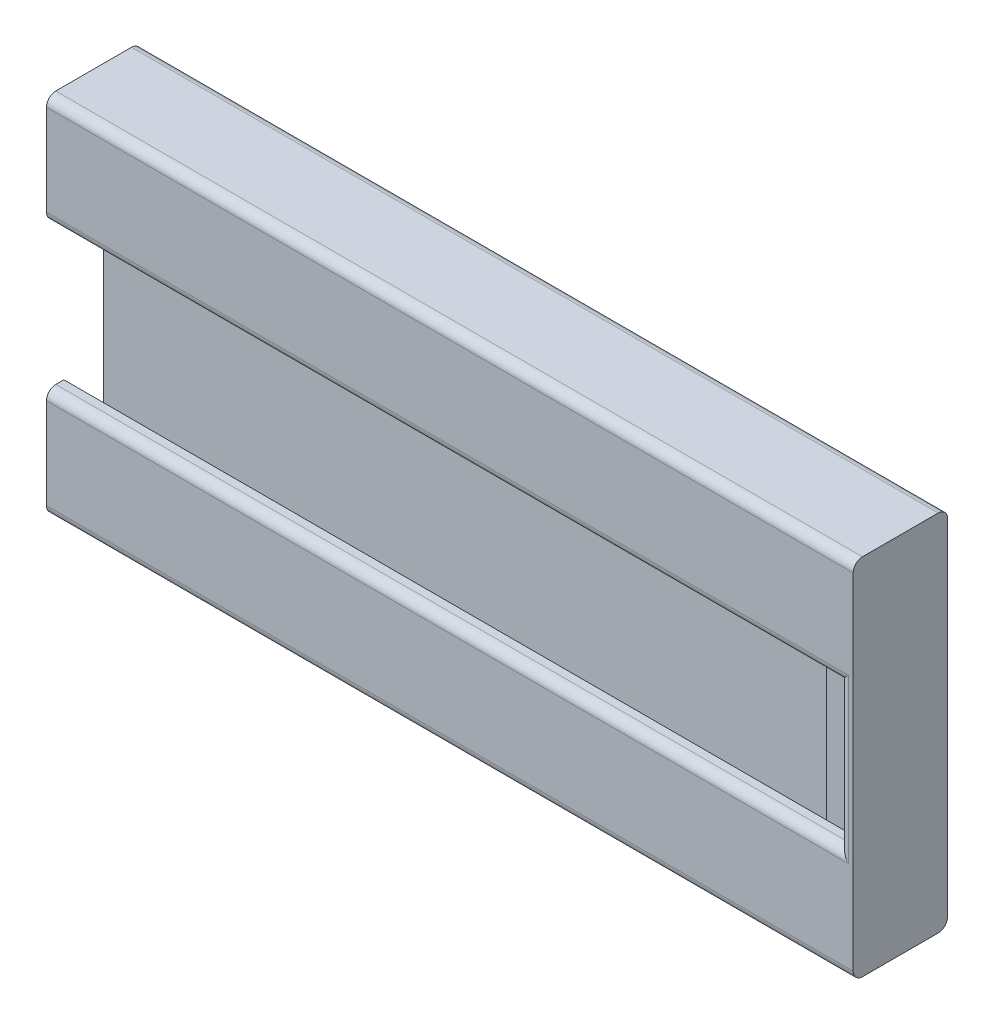
ISO-10303-21;
HEADER;
FILE_DESCRIPTION(('STEP AP214'),'2;1');
FILE_NAME('part.step','',(''),(''),'','','');
FILE_SCHEMA(('AUTOMOTIVE_DESIGN { 1 0 10303 214 1 1 1 1 }'));
ENDSEC;
DATA;
#1=APPLICATION_CONTEXT('core data for automotive mechanical design processes');
#2=APPLICATION_PROTOCOL_DEFINITION('international standard','automotive_design',2000,#1);
#3=PRODUCT_CONTEXT('',#1,'mechanical');
#4=PRODUCT('Part','Part','',(#3));
#5=PRODUCT_RELATED_PRODUCT_CATEGORY('part','',(#4));
#6=PRODUCT_DEFINITION_FORMATION('','',#4);
#7=PRODUCT_DEFINITION_CONTEXT('part definition',#1,'design');
#8=PRODUCT_DEFINITION('design','',#6,#7);
#9=PRODUCT_DEFINITION_SHAPE('','',#8);
#10=(LENGTH_UNIT() NAMED_UNIT(*) SI_UNIT(.MILLI.,.METRE.));
#11=(NAMED_UNIT(*) PLANE_ANGLE_UNIT() SI_UNIT($,.RADIAN.));
#12=(NAMED_UNIT(*) SI_UNIT($,.STERADIAN.) SOLID_ANGLE_UNIT());
#13=UNCERTAINTY_MEASURE_WITH_UNIT(LENGTH_MEASURE(1.E-05),#10,'distance_accuracy_value','');
#14=(GEOMETRIC_REPRESENTATION_CONTEXT(3) GLOBAL_UNCERTAINTY_ASSIGNED_CONTEXT((#13)) GLOBAL_UNIT_ASSIGNED_CONTEXT((#10,
#11,#12)) REPRESENTATION_CONTEXT('',''));
#15=CARTESIAN_POINT('',(0.,0.,0.));
#16=DIRECTION('',(0.,0.,1.));
#17=DIRECTION('',(1.,0.,0.));
#18=AXIS2_PLACEMENT_3D('',#15,#16,#17);
#19=CARTESIAN_POINT('',(-40.2911083721896,0.,6.25));
#20=DIRECTION('',(0.,0.,1.));
#21=DIRECTION('',(1.,0.,0.));
#22=AXIS2_PLACEMENT_3D('',#19,#20,#21);
#23=PLANE('',#22);
#24=DIRECTION('',(1.,0.,0.));
#25=VECTOR('',#24,1.);
#26=CARTESIAN_POINT('',(-40.2911083721896,-0.249999999999984,6.25));
#27=LINE('',#26,#25);
#28=CARTESIAN_POINT('',(0.,-0.25,6.25));
#29=VERTEX_POINT('',#28);
#30=CARTESIAN_POINT('',(85.,-0.250000000000034,6.25));
#31=VERTEX_POINT('',#30);
#32=EDGE_CURVE('E206',#29,#31,#27,.T.);
#33=ORIENTED_EDGE('',*,*,#32,.F.);
#34=DIRECTION('',(0.,1.,0.));
#35=VECTOR('',#34,1.);
#36=CARTESIAN_POINT('',(0.,0.,6.25));
#37=LINE('',#36,#35);
#38=CARTESIAN_POINT('',(0.,9.75,6.25));
#39=VERTEX_POINT('',#38);
#40=EDGE_CURVE('E267',#29,#39,#37,.T.);
#41=ORIENTED_EDGE('',*,*,#40,.T.);
#42=DIRECTION('',(1.,0.,0.));
#43=VECTOR('',#42,1.);
#44=CARTESIAN_POINT('',(-40.2911083721896,9.75000000000002,6.25));
#45=LINE('',#44,#43);
#46=CARTESIAN_POINT('',(85.,9.74999999999997,6.25));
#47=VERTEX_POINT('',#46);
#48=EDGE_CURVE('E205',#39,#47,#45,.T.);
#49=ORIENTED_EDGE('',*,*,#48,.T.);
#50=DIRECTION('',(0.,-1.,0.));
#51=VECTOR('',#50,1.);
#52=CARTESIAN_POINT('',(85.,0.,6.25));
#53=LINE('',#52,#51);
#54=EDGE_CURVE('E194',#47,#31,#53,.T.);
#55=ORIENTED_EDGE('',*,*,#54,.T.);
#56=EDGE_LOOP('',(#33,#41,#49,#55));
#57=FACE_BOUND('',#56,.T.);
#58=ADVANCED_FACE('F63',(#57),#23,.F.);
#59=CARTESIAN_POINT('',(-40.2911083721896,-0.249999999999984,0.));
#60=DIRECTION('',(0.,-1.,0.));
#61=DIRECTION('',(1.,0.,0.));
#62=AXIS2_PLACEMENT_3D('',#59,#60,#61);
#63=PLANE('',#62);
#64=DIRECTION('',(1.,0.,0.));
#65=VECTOR('',#64,1.);
#66=CARTESIAN_POINT('',(-40.2911083721896,-0.249999999999984,-0.250000000000004));
#67=LINE('',#66,#65);
#68=CARTESIAN_POINT('',(0.,-0.250000000000034,-0.250000000000004));
#69=VERTEX_POINT('',#68);
#70=CARTESIAN_POINT('',(85.,-0.250000000000034,-0.250000000000004));
#71=VERTEX_POINT('',#70);
#72=EDGE_CURVE('E213',#69,#71,#67,.T.);
#73=ORIENTED_EDGE('',*,*,#72,.F.);
#74=DIRECTION('',(0.,0.,1.));
#75=VECTOR('',#74,1.);
#76=CARTESIAN_POINT('',(0.,-0.25,0.));
#77=LINE('',#76,#75);
#78=EDGE_CURVE('E208',#69,#29,#77,.T.);
#79=ORIENTED_EDGE('',*,*,#78,.T.);
#80=ORIENTED_EDGE('',*,*,#32,.T.);
#81=DIRECTION('',(0.,0.,-1.));
#82=VECTOR('',#81,1.);
#83=CARTESIAN_POINT('',(85.,-0.250000000000034,0.));
#84=LINE('',#83,#82);
#85=EDGE_CURVE('E190',#31,#71,#84,.T.);
#86=ORIENTED_EDGE('',*,*,#85,.T.);
#87=EDGE_LOOP('',(#73,#79,#80,#86));
#88=FACE_BOUND('',#87,.T.);
#89=ADVANCED_FACE('F210',(#88),#63,.F.);
#90=CARTESIAN_POINT('',(-40.2911083721896,0.,-0.250000000000004));
#91=DIRECTION('',(0.,0.,1.));
#92=DIRECTION('',(1.,0.,0.));
#93=AXIS2_PLACEMENT_3D('',#90,#91,#92);
#94=PLANE('',#93);
#95=DIRECTION('',(0.,1.,0.));
#96=VECTOR('',#95,1.);
#97=CARTESIAN_POINT('',(0.,0.,-0.250000000000004));
#98=LINE('',#97,#96);
#99=CARTESIAN_POINT('',(0.,35.25,-0.250000000000004));
#100=VERTEX_POINT('',#99);
#101=EDGE_CURVE('E387',#69,#100,#98,.T.);
#102=ORIENTED_EDGE('',*,*,#101,.F.);
#103=ORIENTED_EDGE('',*,*,#72,.T.);
#104=DIRECTION('',(0.,-1.,0.));
#105=VECTOR('',#104,1.);
#106=CARTESIAN_POINT('',(85.,0.,-0.250000000000004));
#107=LINE('',#106,#105);
#108=CARTESIAN_POINT('',(85.,35.25,-0.250000000000004));
#109=VERTEX_POINT('',#108);
#110=EDGE_CURVE('E197',#109,#71,#107,.T.);
#111=ORIENTED_EDGE('',*,*,#110,.F.);
#112=DIRECTION('',(1.,0.,0.));
#113=VECTOR('',#112,1.);
#114=CARTESIAN_POINT('',(-40.2911083721896,35.25,-0.250000000000004));
#115=LINE('',#114,#113);
#116=EDGE_CURVE('E251',#100,#109,#115,.T.);
#117=ORIENTED_EDGE('',*,*,#116,.F.);
#118=EDGE_LOOP('',(#102,#103,#111,#117));
#119=FACE_BOUND('',#118,.T.);
#120=ADVANCED_FACE('F419',(#119),#94,.T.);
#121=CARTESIAN_POINT('',(-40.2911083721896,35.25,-1.88150777009792E-13));
#122=DIRECTION('',(0.,-1.,0.));
#123=DIRECTION('',(0.,0.,-1.));
#124=AXIS2_PLACEMENT_3D('',#121,#122,#123);
#125=PLANE('',#124);
#126=DIRECTION('',(0.,0.,1.));
#127=VECTOR('',#126,1.);
#128=CARTESIAN_POINT('',(0.,35.25,-1.88150777009792E-13));
#129=LINE('',#128,#127);
#130=CARTESIAN_POINT('',(0.,35.2500000000001,6.25));
#131=VERTEX_POINT('',#130);
#132=EDGE_CURVE('E383',#100,#131,#129,.T.);
#133=ORIENTED_EDGE('',*,*,#132,.F.);
#134=ORIENTED_EDGE('',*,*,#116,.T.);
#135=DIRECTION('',(0.,0.,-1.));
#136=VECTOR('',#135,1.);
#137=CARTESIAN_POINT('',(85.,35.25,-1.88150777009792E-13));
#138=LINE('',#137,#136);
#139=CARTESIAN_POINT('',(85.,35.25,6.25));
#140=VERTEX_POINT('',#139);
#141=EDGE_CURVE('E231',#140,#109,#138,.T.);
#142=ORIENTED_EDGE('',*,*,#141,.F.);
#143=DIRECTION('',(1.,0.,0.));
#144=VECTOR('',#143,1.);
#145=CARTESIAN_POINT('',(-40.2911083721896,35.2500000000001,6.25));
#146=LINE('',#145,#144);
#147=EDGE_CURVE('E260',#131,#140,#146,.T.);
#148=ORIENTED_EDGE('',*,*,#147,.F.);
#149=EDGE_LOOP('',(#133,#134,#142,#148));
#150=FACE_BOUND('',#149,.T.);
#151=ADVANCED_FACE('F414',(#150),#125,.T.);
#152=DIRECTION('',(1.,0.,0.));
#153=VECTOR('',#152,1.);
#154=CARTESIAN_POINT('',(-40.2911083721896,25.2500000000001,6.24999999999999));
#155=LINE('',#154,#153);
#156=CARTESIAN_POINT('',(0.,25.2500000000001,6.24999999999999));
#157=VERTEX_POINT('',#156);
#158=CARTESIAN_POINT('',(85.,25.25,6.24999999999999));
#159=VERTEX_POINT('',#158);
#160=EDGE_CURVE('E257',#157,#159,#155,.T.);
#161=ORIENTED_EDGE('',*,*,#160,.F.);
#162=DIRECTION('',(0.,1.,0.));
#163=VECTOR('',#162,1.);
#164=CARTESIAN_POINT('',(0.,0.,6.25));
#165=LINE('',#164,#163);
#166=EDGE_CURVE('E379',#157,#131,#165,.T.);
#167=ORIENTED_EDGE('',*,*,#166,.T.);
#168=ORIENTED_EDGE('',*,*,#147,.T.);
#169=EDGE_CURVE('E222',#140,#159,#53,.T.);
#170=ORIENTED_EDGE('',*,*,#169,.T.);
#171=EDGE_LOOP('',(#161,#167,#168,#170));
#172=FACE_BOUND('',#171,.T.);
#173=ADVANCED_FACE('F415',(#172),#23,.F.);
#174=CARTESIAN_POINT('',(-40.2911083721896,25.2500000000001,0.));
#175=DIRECTION('',(0.,1.,0.));
#176=DIRECTION('',(0.,0.,1.));
#177=AXIS2_PLACEMENT_3D('',#174,#175,#176);
#178=PLANE('',#177);
#179=DIRECTION('',(0.,0.,1.));
#180=VECTOR('',#179,1.);
#181=CARTESIAN_POINT('',(85.,25.25,0.));
#182=LINE('',#181,#180);
#183=CARTESIAN_POINT('',(85.,25.25,7.11797479041743));
#184=VERTEX_POINT('',#183);
#185=EDGE_CURVE('E223',#159,#184,#182,.T.);
#186=ORIENTED_EDGE('',*,*,#185,.T.);
#187=DIRECTION('',(1.,0.,0.));
#188=VECTOR('',#187,1.);
#189=CARTESIAN_POINT('',(0.,25.2500000000001,7.11797479041743));
#190=LINE('',#189,#188);
#191=CARTESIAN_POINT('',(0.,25.2500000000001,7.11797479041743));
#192=VERTEX_POINT('',#191);
#193=EDGE_CURVE('E289',#184,#192,#190,.F.);
#194=ORIENTED_EDGE('',*,*,#193,.T.);
#195=DIRECTION('',(0.,0.,-1.));
#196=VECTOR('',#195,1.);
#197=CARTESIAN_POINT('',(0.,25.2500000000001,0.));
#198=LINE('',#197,#196);
#199=EDGE_CURVE('E378',#192,#157,#198,.T.);
#200=ORIENTED_EDGE('',*,*,#199,.T.);
#201=ORIENTED_EDGE('',*,*,#160,.T.);
#202=EDGE_LOOP('',(#186,#194,#200,#201));
#203=FACE_BOUND('',#202,.T.);
#204=ADVANCED_FACE('F409',(#203),#178,.F.);
#205=CARTESIAN_POINT('',(-40.2911083721896,0.,8.11797479041744));
#206=DIRECTION('',(0.,0.,1.));
#207=DIRECTION('',(1.,0.,0.));
#208=AXIS2_PLACEMENT_3D('',#205,#206,#207);
#209=PLANE('',#208);
#210=DIRECTION('',(0.,1.,0.));
#211=VECTOR('',#210,1.);
#212=CARTESIAN_POINT('',(0.,0.,8.11797479041744));
#213=LINE('',#212,#211);
#214=CARTESIAN_POINT('',(0.,26.2500000000001,8.11797479041744));
#215=VERTEX_POINT('',#214);
#216=CARTESIAN_POINT('',(0.,36.,8.11797479041744));
#217=VERTEX_POINT('',#216);
#218=EDGE_CURVE('E372',#215,#217,#213,.T.);
#219=ORIENTED_EDGE('',*,*,#218,.F.);
#220=DIRECTION('',(1.,0.,0.));
#221=VECTOR('',#220,1.);
#222=CARTESIAN_POINT('',(85.,26.25,8.11797479041744));
#223=LINE('',#222,#221);
#224=CARTESIAN_POINT('',(86.,26.25,8.11797479041744));
#225=VERTEX_POINT('',#224);
#226=EDGE_CURVE('E282',#215,#225,#223,.T.);
#227=ORIENTED_EDGE('',*,*,#226,.T.);
#228=DIRECTION('',(0.,-1.,0.));
#229=VECTOR('',#228,1.);
#230=CARTESIAN_POINT('',(86.,9.74999999999997,8.11797479041744));
#231=LINE('',#230,#229);
#232=CARTESIAN_POINT('',(86.,8.74999999999997,8.11797479041744));
#233=VERTEX_POINT('',#232);
#234=EDGE_CURVE('E276',#225,#233,#231,.T.);
#235=ORIENTED_EDGE('',*,*,#234,.T.);
#236=DIRECTION('',(1.,0.,0.));
#237=VECTOR('',#236,1.);
#238=CARTESIAN_POINT('',(-40.2911083721896,8.75000000000002,8.11797479041744));
#239=LINE('',#238,#237);
#240=CARTESIAN_POINT('',(0.,8.75,8.11797479041744));
#241=VERTEX_POINT('',#240);
#242=EDGE_CURVE('E277',#233,#241,#239,.F.);
#243=ORIENTED_EDGE('',*,*,#242,.T.);
#244=DIRECTION('',(0.,1.,0.));
#245=VECTOR('',#244,1.);
#246=CARTESIAN_POINT('',(0.,0.,8.11797479041744));
#247=LINE('',#246,#245);
#248=CARTESIAN_POINT('',(0.,-1.,8.11797479041744));
#249=VERTEX_POINT('',#248);
#250=EDGE_CURVE('E215',#249,#241,#247,.T.);
#251=ORIENTED_EDGE('',*,*,#250,.F.);
#252=DIRECTION('',(1.,0.,0.));
#253=VECTOR('',#252,1.);
#254=CARTESIAN_POINT('',(86.5,-1.00000000000004,8.11797479041744));
#255=LINE('',#254,#253);
#256=CARTESIAN_POINT('',(86.5,-1.00000000000004,8.11797479041744));
#257=VERTEX_POINT('',#256);
#258=EDGE_CURVE('E275',#249,#257,#255,.T.);
#259=ORIENTED_EDGE('',*,*,#258,.T.);
#260=DIRECTION('',(0.,-1.,0.));
#261=VECTOR('',#260,1.);
#262=CARTESIAN_POINT('',(86.5,37.,8.11797479041744));
#263=LINE('',#262,#261);
#264=CARTESIAN_POINT('',(86.5,36.,8.11797479041744));
#265=VERTEX_POINT('',#264);
#266=EDGE_CURVE('E347',#265,#257,#263,.T.);
#267=ORIENTED_EDGE('',*,*,#266,.F.);
#268=DIRECTION('',(1.,0.,0.));
#269=VECTOR('',#268,1.);
#270=CARTESIAN_POINT('',(-40.2911083721896,36.,8.11797479041744));
#271=LINE('',#270,#269);
#272=EDGE_CURVE('E268',#265,#217,#271,.F.);
#273=ORIENTED_EDGE('',*,*,#272,.T.);
#274=EDGE_LOOP('',(#219,#227,#235,#243,#251,#259,#267,#273));
#275=FACE_BOUND('',#274,.T.);
#276=ADVANCED_FACE('F402',(#275),#209,.T.);
#277=CARTESIAN_POINT('',(-40.2911083721896,37.0000000000001,0.));
#278=DIRECTION('',(0.,1.,0.));
#279=DIRECTION('',(-1.,0.,0.));
#280=AXIS2_PLACEMENT_3D('',#277,#278,#279);
#281=PLANE('',#280);
#282=DIRECTION('',(0.,0.,-1.));
#283=VECTOR('',#282,1.);
#284=CARTESIAN_POINT('',(0.,37.,0.));
#285=LINE('',#284,#283);
#286=CARTESIAN_POINT('',(0.,37.,7.11797479041744));
#287=VERTEX_POINT('',#286);
#288=CARTESIAN_POINT('',(0.,37.,-1.));
#289=VERTEX_POINT('',#288);
#290=EDGE_CURVE('E367',#287,#289,#285,.T.);
#291=ORIENTED_EDGE('',*,*,#290,.F.);
#292=DIRECTION('',(1.,0.,0.));
#293=VECTOR('',#292,1.);
#294=CARTESIAN_POINT('',(-40.2911083721896,37.0000000000001,7.11797479041744));
#295=LINE('',#294,#293);
#296=CARTESIAN_POINT('',(86.5,37.,7.11797479041744));
#297=VERTEX_POINT('',#296);
#298=EDGE_CURVE('E12',#287,#297,#295,.T.);
#299=ORIENTED_EDGE('',*,*,#298,.T.);
#300=DIRECTION('',(0.,0.,1.));
#301=VECTOR('',#300,1.);
#302=CARTESIAN_POINT('',(86.5,37.,8.11797479041744));
#303=LINE('',#302,#301);
#304=CARTESIAN_POINT('',(86.5,37.,-0.999999999999999));
#305=VERTEX_POINT('',#304);
#306=EDGE_CURVE('E218',#305,#297,#303,.T.);
#307=ORIENTED_EDGE('',*,*,#306,.F.);
#308=DIRECTION('',(1.,0.,0.));
#309=VECTOR('',#308,1.);
#310=CARTESIAN_POINT('',(0.,37.,-1.));
#311=LINE('',#310,#309);
#312=EDGE_CURVE('E72',#305,#289,#311,.F.);
#313=ORIENTED_EDGE('',*,*,#312,.T.);
#314=EDGE_LOOP('',(#291,#299,#307,#313));
#315=FACE_BOUND('',#314,.T.);
#316=ADVANCED_FACE('F464',(#315),#281,.T.);
#317=CARTESIAN_POINT('',(-40.2911083721896,0.,-2.));
#318=DIRECTION('',(0.,0.,1.));
#319=DIRECTION('',(0.,-1.,0.));
#320=AXIS2_PLACEMENT_3D('',#317,#318,#319);
#321=PLANE('',#320);
#322=DIRECTION('',(0.,1.,0.));
#323=VECTOR('',#322,1.);
#324=CARTESIAN_POINT('',(86.5,37.,-2.));
#325=LINE('',#324,#323);
#326=CARTESIAN_POINT('',(86.5,-1.00000000000004,-2.));
#327=VERTEX_POINT('',#326);
#328=CARTESIAN_POINT('',(86.5,36.,-2.));
#329=VERTEX_POINT('',#328);
#330=EDGE_CURVE('E227',#327,#329,#325,.T.);
#331=ORIENTED_EDGE('',*,*,#330,.F.);
#332=DIRECTION('',(1.,0.,0.));
#333=VECTOR('',#332,1.);
#334=CARTESIAN_POINT('',(-40.2911083721896,-0.999999999999986,-2.));
#335=LINE('',#334,#333);
#336=CARTESIAN_POINT('',(0.,-1.,-2.));
#337=VERTEX_POINT('',#336);
#338=EDGE_CURVE('E332',#327,#337,#335,.F.);
#339=ORIENTED_EDGE('',*,*,#338,.T.);
#340=DIRECTION('',(0.,1.,0.));
#341=VECTOR('',#340,1.);
#342=CARTESIAN_POINT('',(0.,0.,-2.));
#343=LINE('',#342,#341);
#344=CARTESIAN_POINT('',(0.,36.,-2.));
#345=VERTEX_POINT('',#344);
#346=EDGE_CURVE('E368',#337,#345,#343,.T.);
#347=ORIENTED_EDGE('',*,*,#346,.T.);
#348=DIRECTION('',(1.,0.,0.));
#349=VECTOR('',#348,1.);
#350=CARTESIAN_POINT('',(86.5,36.,-2.));
#351=LINE('',#350,#349);
#352=EDGE_CURVE('E330',#345,#329,#351,.T.);
#353=ORIENTED_EDGE('',*,*,#352,.T.);
#354=EDGE_LOOP('',(#331,#339,#347,#353));
#355=FACE_BOUND('',#354,.T.);
#356=ADVANCED_FACE('F469',(#355),#321,.F.);
#357=CARTESIAN_POINT('',(-40.2911083721896,-1.99999999999999,0.));
#358=DIRECTION('',(0.,1.,0.));
#359=DIRECTION('',(-1.,0.,0.));
#360=AXIS2_PLACEMENT_3D('',#357,#358,#359);
#361=PLANE('',#360);
#362=DIRECTION('',(0.,0.,-1.));
#363=VECTOR('',#362,1.);
#364=CARTESIAN_POINT('',(86.5,-2.00000000000004,8.11797479041744));
#365=LINE('',#364,#363);
#366=CARTESIAN_POINT('',(86.5,-2.00000000000004,7.11797479041744));
#367=VERTEX_POINT('',#366);
#368=CARTESIAN_POINT('',(86.5,-2.00000000000004,-0.999999999999997));
#369=VERTEX_POINT('',#368);
#370=EDGE_CURVE('E348',#367,#369,#365,.T.);
#371=ORIENTED_EDGE('',*,*,#370,.F.);
#372=DIRECTION('',(1.,0.,0.));
#373=VECTOR('',#372,1.);
#374=CARTESIAN_POINT('',(0.,-2.,7.11797479041744));
#375=LINE('',#374,#373);
#376=CARTESIAN_POINT('',(0.,-2.,7.11797479041744));
#377=VERTEX_POINT('',#376);
#378=EDGE_CURVE('E322',#367,#377,#375,.F.);
#379=ORIENTED_EDGE('',*,*,#378,.T.);
#380=DIRECTION('',(0.,0.,-1.));
#381=VECTOR('',#380,1.);
#382=CARTESIAN_POINT('',(0.,-2.,0.));
#383=LINE('',#382,#381);
#384=CARTESIAN_POINT('',(0.,-2.,-0.999999999999997));
#385=VERTEX_POINT('',#384);
#386=EDGE_CURVE('E361',#377,#385,#383,.T.);
#387=ORIENTED_EDGE('',*,*,#386,.T.);
#388=DIRECTION('',(1.,0.,0.));
#389=VECTOR('',#388,1.);
#390=CARTESIAN_POINT('',(-40.2911083721896,-1.99999999999999,-0.999999999999997));
#391=LINE('',#390,#389);
#392=EDGE_CURVE('E319',#385,#369,#391,.T.);
#393=ORIENTED_EDGE('',*,*,#392,.T.);
#394=EDGE_LOOP('',(#371,#379,#387,#393));
#395=FACE_BOUND('',#394,.T.);
#396=ADVANCED_FACE('F478',(#395),#361,.F.);
#397=CARTESIAN_POINT('',(-40.2911083721896,9.75000000000002,0.));
#398=DIRECTION('',(0.,1.,0.));
#399=DIRECTION('',(-1.,0.,0.));
#400=AXIS2_PLACEMENT_3D('',#397,#398,#399);
#401=PLANE('',#400);
#402=DIRECTION('',(0.,0.,-1.));
#403=VECTOR('',#402,1.);
#404=CARTESIAN_POINT('',(0.,9.75,0.));
#405=LINE('',#404,#403);
#406=CARTESIAN_POINT('',(0.,9.75,7.11797479041744));
#407=VERTEX_POINT('',#406);
#408=EDGE_CURVE('E264',#407,#39,#405,.T.);
#409=ORIENTED_EDGE('',*,*,#408,.F.);
#410=DIRECTION('',(1.,0.,0.));
#411=VECTOR('',#410,1.);
#412=CARTESIAN_POINT('',(-40.2911083721896,9.75000000000002,7.11797479041744));
#413=LINE('',#412,#411);
#414=CARTESIAN_POINT('',(85.,9.74999999999997,7.11797479041744));
#415=VERTEX_POINT('',#414);
#416=EDGE_CURVE('E306',#407,#415,#413,.T.);
#417=ORIENTED_EDGE('',*,*,#416,.T.);
#418=DIRECTION('',(0.,0.,1.));
#419=VECTOR('',#418,1.);
#420=CARTESIAN_POINT('',(85.,9.74999999999997,0.));
#421=LINE('',#420,#419);
#422=EDGE_CURVE('E217',#47,#415,#421,.T.);
#423=ORIENTED_EDGE('',*,*,#422,.F.);
#424=ORIENTED_EDGE('',*,*,#48,.F.);
#425=EDGE_LOOP('',(#409,#417,#423,#424));
#426=FACE_BOUND('',#425,.T.);
#427=ADVANCED_FACE('F394',(#426),#401,.T.);
#428=CARTESIAN_POINT('',(0.,0.,2.));
#429=DIRECTION('',(1.,0.,0.));
#430=DIRECTION('',(0.,1.,0.));
#431=AXIS2_PLACEMENT_3D('',#428,#429,#430);
#432=PLANE('',#431);
#433=ORIENTED_EDGE('',*,*,#199,.F.);
#434=CARTESIAN_POINT('',(0.,26.2500000000001,7.11797479041744));
#435=DIRECTION('',(1.,0.,0.));
#436=DIRECTION('',(0.,1.,0.));
#437=AXIS2_PLACEMENT_3D('',#434,#435,#436);
#438=CIRCLE('',#437,1.);
#439=EDGE_CURVE('E302',#192,#215,#438,.F.);
#440=ORIENTED_EDGE('',*,*,#439,.T.);
#441=ORIENTED_EDGE('',*,*,#218,.T.);
#442=CARTESIAN_POINT('',(0.,36.,7.11797479041744));
#443=DIRECTION('',(1.,0.,0.));
#444=DIRECTION('',(0.,1.,0.));
#445=AXIS2_PLACEMENT_3D('',#442,#443,#444);
#446=CIRCLE('',#445,1.);
#447=EDGE_CURVE('E291',#217,#287,#446,.F.);
#448=ORIENTED_EDGE('',*,*,#447,.T.);
#449=ORIENTED_EDGE('',*,*,#290,.T.);
#450=CARTESIAN_POINT('',(0.,36.,-1.));
#451=DIRECTION('',(1.,0.,0.));
#452=DIRECTION('',(0.,1.,0.));
#453=AXIS2_PLACEMENT_3D('',#450,#451,#452);
#454=CIRCLE('',#453,1.);
#455=EDGE_CURVE('E292',#289,#345,#454,.F.);
#456=ORIENTED_EDGE('',*,*,#455,.T.);
#457=ORIENTED_EDGE('',*,*,#346,.F.);
#458=CARTESIAN_POINT('',(0.,-1.,-0.999999999999997));
#459=DIRECTION('',(1.,0.,0.));
#460=DIRECTION('',(0.,1.,0.));
#461=AXIS2_PLACEMENT_3D('',#458,#459,#460);
#462=CIRCLE('',#461,1.);
#463=EDGE_CURVE('E298',#337,#385,#462,.F.);
#464=ORIENTED_EDGE('',*,*,#463,.T.);
#465=ORIENTED_EDGE('',*,*,#386,.F.);
#466=CARTESIAN_POINT('',(0.,-1.,7.11797479041744));
#467=DIRECTION('',(1.,0.,0.));
#468=DIRECTION('',(0.,1.,0.));
#469=AXIS2_PLACEMENT_3D('',#466,#467,#468);
#470=CIRCLE('',#469,1.);
#471=EDGE_CURVE('E300',#377,#249,#470,.F.);
#472=ORIENTED_EDGE('',*,*,#471,.T.);
#473=ORIENTED_EDGE('',*,*,#250,.T.);
#474=CARTESIAN_POINT('',(0.,8.75,7.11797479041744));
#475=DIRECTION('',(1.,0.,0.));
#476=DIRECTION('',(0.,1.,0.));
#477=AXIS2_PLACEMENT_3D('',#474,#475,#476);
#478=CIRCLE('',#477,1.);
#479=EDGE_CURVE('E305',#241,#407,#478,.F.);
#480=ORIENTED_EDGE('',*,*,#479,.T.);
#481=ORIENTED_EDGE('',*,*,#408,.T.);
#482=ORIENTED_EDGE('',*,*,#40,.F.);
#483=ORIENTED_EDGE('',*,*,#78,.F.);
#484=ORIENTED_EDGE('',*,*,#101,.T.);
#485=ORIENTED_EDGE('',*,*,#132,.T.);
#486=ORIENTED_EDGE('',*,*,#166,.F.);
#487=EDGE_LOOP('',(#433,#440,#441,#448,#449,#456,#457,#464,#465,#472,#473,#480,#481,#482,#483,
#484,#485,#486));
#488=FACE_BOUND('',#487,.T.);
#489=ADVANCED_FACE('F410',(#488),#432,.F.);
#490=CARTESIAN_POINT('',(85.,0.,0.));
#491=DIRECTION('',(1.,0.,0.));
#492=DIRECTION('',(0.,1.,0.));
#493=AXIS2_PLACEMENT_3D('',#490,#491,#492);
#494=PLANE('',#493);
#495=ORIENTED_EDGE('',*,*,#422,.T.);
#496=DIRECTION('',(0.,-1.,0.));
#497=VECTOR('',#496,1.);
#498=CARTESIAN_POINT('',(85.,25.25,7.11797479041744));
#499=LINE('',#498,#497);
#500=EDGE_CURVE('E288',#415,#184,#499,.F.);
#501=ORIENTED_EDGE('',*,*,#500,.T.);
#502=ORIENTED_EDGE('',*,*,#185,.F.);
#503=ORIENTED_EDGE('',*,*,#169,.F.);
#504=ORIENTED_EDGE('',*,*,#141,.T.);
#505=ORIENTED_EDGE('',*,*,#110,.T.);
#506=ORIENTED_EDGE('',*,*,#85,.F.);
#507=ORIENTED_EDGE('',*,*,#54,.F.);
#508=EDGE_LOOP('',(#495,#501,#502,#503,#504,#505,#506,#507));
#509=FACE_BOUND('',#508,.T.);
#510=ADVANCED_FACE('F195',(#509),#494,.F.);
#511=CARTESIAN_POINT('',(86.5,0.,0.));
#512=DIRECTION('',(1.,0.,0.));
#513=DIRECTION('',(0.,1.,0.));
#514=AXIS2_PLACEMENT_3D('',#511,#512,#513);
#515=PLANE('',#514);
#516=ORIENTED_EDGE('',*,*,#266,.T.);
#517=CARTESIAN_POINT('',(86.5,-1.00000000000004,7.11797479041744));
#518=DIRECTION('',(1.,0.,0.));
#519=DIRECTION('',(0.,1.,0.));
#520=AXIS2_PLACEMENT_3D('',#517,#518,#519);
#521=CIRCLE('',#520,1.);
#522=EDGE_CURVE('E320',#257,#367,#521,.T.);
#523=ORIENTED_EDGE('',*,*,#522,.T.);
#524=ORIENTED_EDGE('',*,*,#370,.T.);
#525=CARTESIAN_POINT('',(86.5,-1.00000000000004,-0.999999999999997));
#526=DIRECTION('',(1.,0.,0.));
#527=DIRECTION('',(0.,1.,0.));
#528=AXIS2_PLACEMENT_3D('',#525,#526,#527);
#529=CIRCLE('',#528,1.);
#530=EDGE_CURVE('E314',#369,#327,#529,.T.);
#531=ORIENTED_EDGE('',*,*,#530,.T.);
#532=ORIENTED_EDGE('',*,*,#330,.T.);
#533=CARTESIAN_POINT('',(86.5,36.,-1.));
#534=DIRECTION('',(1.,0.,0.));
#535=DIRECTION('',(0.,1.,0.));
#536=AXIS2_PLACEMENT_3D('',#533,#534,#535);
#537=CIRCLE('',#536,1.);
#538=EDGE_CURVE('E88',#329,#305,#537,.T.);
#539=ORIENTED_EDGE('',*,*,#538,.T.);
#540=ORIENTED_EDGE('',*,*,#306,.T.);
#541=CARTESIAN_POINT('',(86.5,36.,7.11797479041744));
#542=DIRECTION('',(1.,0.,0.));
#543=DIRECTION('',(0.,1.,0.));
#544=AXIS2_PLACEMENT_3D('',#541,#542,#543);
#545=CIRCLE('',#544,1.);
#546=EDGE_CURVE('E80',#297,#265,#545,.T.);
#547=ORIENTED_EDGE('',*,*,#546,.T.);
#548=EDGE_LOOP('',(#516,#523,#524,#531,#532,#539,#540,#547));
#549=FACE_BOUND('',#548,.T.);
#550=ADVANCED_FACE('F436',(#549),#515,.T.);
#551=CARTESIAN_POINT('',(-40.2911083721896,26.2500000000001,7.11797479041744));
#552=DIRECTION('',(-1.,0.,0.));
#553=DIRECTION('',(0.,-1.,0.));
#554=AXIS2_PLACEMENT_3D('',#551,#552,#553);
#555=CYLINDRICAL_SURFACE('',#554,1.);
#556=ORIENTED_EDGE('',*,*,#439,.F.);
#557=ORIENTED_EDGE('',*,*,#193,.F.);
#558=CARTESIAN_POINT('',(86.,26.25,7.11797479041744));
#559=DIRECTION('',(-0.707106781186547,0.707106781186548,0.));
#560=DIRECTION('',(0.707106781186548,0.707106781186547,0.));
#561=AXIS2_PLACEMENT_3D('',#558,#559,#560);
#562=ELLIPSE('',#561,1.41421356237309,1.);
#563=EDGE_CURVE('E61',#225,#184,#562,.F.);
#564=ORIENTED_EDGE('',*,*,#563,.F.);
#565=ORIENTED_EDGE('',*,*,#226,.F.);
#566=EDGE_LOOP('',(#556,#557,#564,#565));
#567=FACE_BOUND('',#566,.T.);
#568=ADVANCED_FACE('F403',(#567),#555,.T.);
#569=CARTESIAN_POINT('',(-40.2911083721896,8.75000000000002,7.11797479041744));
#570=DIRECTION('',(1.,0.,0.));
#571=DIRECTION('',(0.,1.,0.));
#572=AXIS2_PLACEMENT_3D('',#569,#570,#571);
#573=CYLINDRICAL_SURFACE('',#572,1.);
#574=ORIENTED_EDGE('',*,*,#479,.F.);
#575=ORIENTED_EDGE('',*,*,#242,.F.);
#576=CARTESIAN_POINT('',(86.,8.74999999999997,7.11797479041744));
#577=DIRECTION('',(0.707106781186548,0.707106781186547,0.));
#578=DIRECTION('',(-0.707106781186547,0.707106781186548,0.));
#579=AXIS2_PLACEMENT_3D('',#576,#577,#578);
#580=ELLIPSE('',#579,1.41421356237309,1.);
#581=EDGE_CURVE('E333',#415,#233,#580,.T.);
#582=ORIENTED_EDGE('',*,*,#581,.F.);
#583=ORIENTED_EDGE('',*,*,#416,.F.);
#584=EDGE_LOOP('',(#574,#575,#582,#583));
#585=FACE_BOUND('',#584,.T.);
#586=ADVANCED_FACE('F400',(#585),#573,.T.);
#587=CARTESIAN_POINT('',(86.,0.,7.11797479041744));
#588=DIRECTION('',(0.,1.,0.));
#589=DIRECTION('',(-1.,0.,0.));
#590=AXIS2_PLACEMENT_3D('',#587,#588,#589);
#591=CYLINDRICAL_SURFACE('',#590,1.);
#592=ORIENTED_EDGE('',*,*,#563,.T.);
#593=ORIENTED_EDGE('',*,*,#500,.F.);
#594=ORIENTED_EDGE('',*,*,#581,.T.);
#595=ORIENTED_EDGE('',*,*,#234,.F.);
#596=EDGE_LOOP('',(#592,#593,#594,#595));
#597=FACE_BOUND('',#596,.T.);
#598=ADVANCED_FACE('F395',(#597),#591,.T.);
#599=CARTESIAN_POINT('',(-40.2911083721896,-0.999999999999986,7.11797479041744));
#600=DIRECTION('',(-1.,0.,0.));
#601=DIRECTION('',(0.,-1.,0.));
#602=AXIS2_PLACEMENT_3D('',#599,#600,#601);
#603=CYLINDRICAL_SURFACE('',#602,1.);
#604=ORIENTED_EDGE('',*,*,#471,.F.);
#605=ORIENTED_EDGE('',*,*,#378,.F.);
#606=ORIENTED_EDGE('',*,*,#522,.F.);
#607=ORIENTED_EDGE('',*,*,#258,.F.);
#608=EDGE_LOOP('',(#604,#605,#606,#607));
#609=FACE_BOUND('',#608,.T.);
#610=ADVANCED_FACE('F448',(#609),#603,.T.);
#611=CARTESIAN_POINT('',(-40.2911083721896,-0.999999999999986,-0.999999999999997));
#612=DIRECTION('',(1.,0.,0.));
#613=DIRECTION('',(0.,1.,0.));
#614=AXIS2_PLACEMENT_3D('',#611,#612,#613);
#615=CYLINDRICAL_SURFACE('',#614,1.);
#616=ORIENTED_EDGE('',*,*,#463,.F.);
#617=ORIENTED_EDGE('',*,*,#338,.F.);
#618=ORIENTED_EDGE('',*,*,#530,.F.);
#619=ORIENTED_EDGE('',*,*,#392,.F.);
#620=EDGE_LOOP('',(#616,#617,#618,#619));
#621=FACE_BOUND('',#620,.T.);
#622=ADVANCED_FACE('F450',(#621),#615,.T.);
#623=CARTESIAN_POINT('',(-40.2911083721896,36.,7.11797479041744));
#624=DIRECTION('',(1.,0.,0.));
#625=DIRECTION('',(0.,1.,0.));
#626=AXIS2_PLACEMENT_3D('',#623,#624,#625);
#627=CYLINDRICAL_SURFACE('',#626,1.);
#628=ORIENTED_EDGE('',*,*,#447,.F.);
#629=ORIENTED_EDGE('',*,*,#272,.F.);
#630=ORIENTED_EDGE('',*,*,#546,.F.);
#631=ORIENTED_EDGE('',*,*,#298,.F.);
#632=EDGE_LOOP('',(#628,#629,#630,#631));
#633=FACE_BOUND('',#632,.T.);
#634=ADVANCED_FACE('F455',(#633),#627,.T.);
#635=CARTESIAN_POINT('',(-40.2911083721896,36.,-1.));
#636=DIRECTION('',(-1.,0.,0.));
#637=DIRECTION('',(0.,-1.,0.));
#638=AXIS2_PLACEMENT_3D('',#635,#636,#637);
#639=CYLINDRICAL_SURFACE('',#638,1.);
#640=ORIENTED_EDGE('',*,*,#455,.F.);
#641=ORIENTED_EDGE('',*,*,#312,.F.);
#642=ORIENTED_EDGE('',*,*,#538,.F.);
#643=ORIENTED_EDGE('',*,*,#352,.F.);
#644=EDGE_LOOP('',(#640,#641,#642,#643));
#645=FACE_BOUND('',#644,.T.);
#646=ADVANCED_FACE('F62',(#645),#639,.T.);
#647=CLOSED_SHELL('',(#58,#89,#120,#151,#173,#204,#276,#316,#356,#396,#427,#489,#510,#550,#568,
#586,#598,#610,#622,#634,#646));
#648=MANIFOLD_SOLID_BREP('B2',#647);
#649=CARTESIAN_POINT('',(0.,0.,2.));
#650=DIRECTION('',(0.,0.,-1.));
#651=DIRECTION('',(-1.,0.,0.));
#652=AXIS2_PLACEMENT_3D('',#649,#650,#651);
#653=PLANE('',#652);
#654=DIRECTION('',(1.,0.,0.));
#655=VECTOR('',#654,1.);
#656=CARTESIAN_POINT('',(0.,32.875,2.));
#657=LINE('',#656,#655);
#658=CARTESIAN_POINT('',(0.,32.875,2.));
#659=VERTEX_POINT('',#658);
#660=CARTESIAN_POINT('',(83.,32.875,2.));
#661=VERTEX_POINT('',#660);
#662=EDGE_CURVE('E817',#659,#661,#657,.T.);
#663=ORIENTED_EDGE('',*,*,#662,.F.);
#664=DIRECTION('',(0.,-1.,0.));
#665=VECTOR('',#664,1.);
#666=CARTESIAN_POINT('',(0.,0.,2.));
#667=LINE('',#666,#665);
#668=CARTESIAN_POINT('',(0.,2.125,2.));
#669=VERTEX_POINT('',#668);
#670=EDGE_CURVE('E849',#659,#669,#667,.T.);
#671=ORIENTED_EDGE('',*,*,#670,.T.);
#672=DIRECTION('',(1.,0.,0.));
#673=VECTOR('',#672,1.);
#674=CARTESIAN_POINT('',(0.,2.125,2.));
#675=LINE('',#674,#673);
#676=CARTESIAN_POINT('',(83.,2.125,2.));
#677=VERTEX_POINT('',#676);
#678=EDGE_CURVE('E828',#669,#677,#675,.T.);
#679=ORIENTED_EDGE('',*,*,#678,.T.);
#680=DIRECTION('',(0.,1.,0.));
#681=VECTOR('',#680,1.);
#682=CARTESIAN_POINT('',(83.,0.,2.));
#683=LINE('',#682,#681);
#684=EDGE_CURVE('E669',#677,#661,#683,.T.);
#685=ORIENTED_EDGE('',*,*,#684,.T.);
#686=EDGE_LOOP('',(#663,#671,#679,#685));
#687=FACE_BOUND('',#686,.T.);
#688=ADVANCED_FACE('F651',(#687),#653,.F.);
#689=CARTESIAN_POINT('',(0.,0.,2.));
#690=DIRECTION('',(1.,0.,0.));
#691=DIRECTION('',(0.,1.,0.));
#692=AXIS2_PLACEMENT_3D('',#689,#690,#691);
#693=PLANE('',#692);
#694=DIRECTION('',(0.,-1.,0.));
#695=VECTOR('',#694,1.);
#696=CARTESIAN_POINT('',(0.,0.,0.));
#697=LINE('',#696,#695);
#698=CARTESIAN_POINT('',(0.,35.,0.));
#699=VERTEX_POINT('',#698);
#700=CARTESIAN_POINT('',(0.,0.,0.));
#701=VERTEX_POINT('',#700);
#702=EDGE_CURVE('E746',#699,#701,#697,.T.);
#703=ORIENTED_EDGE('',*,*,#702,.T.);
#704=DIRECTION('',(0.,0.,-1.));
#705=VECTOR('',#704,1.);
#706=CARTESIAN_POINT('',(0.,0.,2.));
#707=LINE('',#706,#705);
#708=CARTESIAN_POINT('',(0.,0.,6.));
#709=VERTEX_POINT('',#708);
#710=EDGE_CURVE('E56',#709,#701,#707,.T.);
#711=ORIENTED_EDGE('',*,*,#710,.F.);
#712=DIRECTION('',(0.,1.,0.));
#713=VECTOR('',#712,1.);
#714=CARTESIAN_POINT('',(0.,0.,6.));
#715=LINE('',#714,#713);
#716=CARTESIAN_POINT('',(0.,4.125,6.));
#717=VERTEX_POINT('',#716);
#718=EDGE_CURVE('E742',#709,#717,#715,.T.);
#719=ORIENTED_EDGE('',*,*,#718,.T.);
#720=DIRECTION('',(0.,0.,-1.));
#721=VECTOR('',#720,1.);
#722=CARTESIAN_POINT('',(0.,4.125,6.));
#723=LINE('',#722,#721);
#724=CARTESIAN_POINT('',(0.,4.125,4.));
#725=VERTEX_POINT('',#724);
#726=EDGE_CURVE('E792',#717,#725,#723,.T.);
#727=ORIENTED_EDGE('',*,*,#726,.T.);
#728=DIRECTION('',(0.,1.,0.));
#729=VECTOR('',#728,1.);
#730=CARTESIAN_POINT('',(0.,0.,4.));
#731=LINE('',#730,#729);
#732=CARTESIAN_POINT('',(0.,2.125,4.));
#733=VERTEX_POINT('',#732);
#734=EDGE_CURVE('E795',#733,#725,#731,.T.);
#735=ORIENTED_EDGE('',*,*,#734,.F.);
#736=DIRECTION('',(0.,0.,-1.));
#737=VECTOR('',#736,1.);
#738=CARTESIAN_POINT('',(0.,2.125,4.));
#739=LINE('',#738,#737);
#740=EDGE_CURVE('E845',#733,#669,#739,.T.);
#741=ORIENTED_EDGE('',*,*,#740,.T.);
#742=ORIENTED_EDGE('',*,*,#670,.F.);
#743=DIRECTION('',(0.,0.,-1.));
#744=VECTOR('',#743,1.);
#745=CARTESIAN_POINT('',(0.,32.875,4.));
#746=LINE('',#745,#744);
#747=CARTESIAN_POINT('',(0.,32.875,4.));
#748=VERTEX_POINT('',#747);
#749=EDGE_CURVE('E839',#748,#659,#746,.T.);
#750=ORIENTED_EDGE('',*,*,#749,.F.);
#751=CARTESIAN_POINT('',(0.,30.875,4.));
#752=VERTEX_POINT('',#751);
#753=EDGE_CURVE('E800',#752,#748,#731,.T.);
#754=ORIENTED_EDGE('',*,*,#753,.F.);
#755=DIRECTION('',(0.,0.,-1.));
#756=VECTOR('',#755,1.);
#757=CARTESIAN_POINT('',(0.,30.875,6.));
#758=LINE('',#757,#756);
#759=CARTESIAN_POINT('',(0.,30.875,6.));
#760=VERTEX_POINT('',#759);
#761=EDGE_CURVE('E815',#760,#752,#758,.T.);
#762=ORIENTED_EDGE('',*,*,#761,.F.);
#763=CARTESIAN_POINT('',(0.,35.,6.));
#764=VERTEX_POINT('',#763);
#765=EDGE_CURVE('E766',#760,#764,#715,.T.);
#766=ORIENTED_EDGE('',*,*,#765,.T.);
#767=DIRECTION('',(0.,0.,-1.));
#768=VECTOR('',#767,1.);
#769=CARTESIAN_POINT('',(0.,35.,2.));
#770=LINE('',#769,#768);
#771=EDGE_CURVE('E853',#764,#699,#770,.T.);
#772=ORIENTED_EDGE('',*,*,#771,.T.);
#773=EDGE_LOOP('',(#703,#711,#719,#727,#735,#741,#742,#750,#754,#762,#766,#772));
#774=FACE_BOUND('',#773,.T.);
#775=ADVANCED_FACE('F653',(#774),#693,.F.);
#776=CARTESIAN_POINT('',(0.,0.,2.));
#777=DIRECTION('',(0.,1.,0.));
#778=DIRECTION('',(0.,0.,1.));
#779=AXIS2_PLACEMENT_3D('',#776,#777,#778);
#780=PLANE('',#779);
#781=DIRECTION('',(1.,0.,0.));
#782=VECTOR('',#781,1.);
#783=CARTESIAN_POINT('',(0.,0.,0.));
#784=LINE('',#783,#782);
#785=CARTESIAN_POINT('',(85.,0.,0.));
#786=VERTEX_POINT('',#785);
#787=EDGE_CURVE('E854',#701,#786,#784,.T.);
#788=ORIENTED_EDGE('',*,*,#787,.T.);
#789=DIRECTION('',(0.,0.,-1.));
#790=VECTOR('',#789,1.);
#791=CARTESIAN_POINT('',(85.,0.,2.));
#792=LINE('',#791,#790);
#793=CARTESIAN_POINT('',(85.,0.,6.));
#794=VERTEX_POINT('',#793);
#795=EDGE_CURVE('E659',#794,#786,#792,.T.);
#796=ORIENTED_EDGE('',*,*,#795,.F.);
#797=DIRECTION('',(1.,0.,0.));
#798=VECTOR('',#797,1.);
#799=CARTESIAN_POINT('',(0.,0.,6.));
#800=LINE('',#799,#798);
#801=EDGE_CURVE('E753',#709,#794,#800,.T.);
#802=ORIENTED_EDGE('',*,*,#801,.F.);
#803=ORIENTED_EDGE('',*,*,#710,.T.);
#804=EDGE_LOOP('',(#788,#796,#802,#803));
#805=FACE_BOUND('',#804,.T.);
#806=ADVANCED_FACE('F755',(#805),#780,.F.);
#807=CARTESIAN_POINT('',(85.,0.,2.));
#808=DIRECTION('',(-1.,0.,0.));
#809=DIRECTION('',(0.,-1.,0.));
#810=AXIS2_PLACEMENT_3D('',#807,#808,#809);
#811=PLANE('',#810);
#812=DIRECTION('',(0.,1.,0.));
#813=VECTOR('',#812,1.);
#814=CARTESIAN_POINT('',(85.,0.,0.));
#815=LINE('',#814,#813);
#816=CARTESIAN_POINT('',(85.,35.,0.));
#817=VERTEX_POINT('',#816);
#818=EDGE_CURVE('E857',#786,#817,#815,.T.);
#819=ORIENTED_EDGE('',*,*,#818,.T.);
#820=DIRECTION('',(0.,0.,-1.));
#821=VECTOR('',#820,1.);
#822=CARTESIAN_POINT('',(85.,35.,2.));
#823=LINE('',#822,#821);
#824=CARTESIAN_POINT('',(85.,35.,6.));
#825=VERTEX_POINT('',#824);
#826=EDGE_CURVE('E864',#825,#817,#823,.T.);
#827=ORIENTED_EDGE('',*,*,#826,.F.);
#828=DIRECTION('',(0.,1.,0.));
#829=VECTOR('',#828,1.);
#830=CARTESIAN_POINT('',(85.,0.,6.));
#831=LINE('',#830,#829);
#832=EDGE_CURVE('E758',#794,#825,#831,.T.);
#833=ORIENTED_EDGE('',*,*,#832,.F.);
#834=ORIENTED_EDGE('',*,*,#795,.T.);
#835=EDGE_LOOP('',(#819,#827,#833,#834));
#836=FACE_BOUND('',#835,.T.);
#837=ADVANCED_FACE('F867',(#836),#811,.F.);
#838=CARTESIAN_POINT('',(0.,35.,2.));
#839=DIRECTION('',(0.,-1.,0.));
#840=DIRECTION('',(0.,0.,-1.));
#841=AXIS2_PLACEMENT_3D('',#838,#839,#840);
#842=PLANE('',#841);
#843=DIRECTION('',(-1.,0.,0.));
#844=VECTOR('',#843,1.);
#845=CARTESIAN_POINT('',(0.,35.,0.));
#846=LINE('',#845,#844);
#847=EDGE_CURVE('E672',#817,#699,#846,.T.);
#848=ORIENTED_EDGE('',*,*,#847,.T.);
#849=ORIENTED_EDGE('',*,*,#771,.F.);
#850=DIRECTION('',(-1.,0.,0.));
#851=VECTOR('',#850,1.);
#852=CARTESIAN_POINT('',(0.,35.,6.));
#853=LINE('',#852,#851);
#854=EDGE_CURVE('E778',#825,#764,#853,.T.);
#855=ORIENTED_EDGE('',*,*,#854,.F.);
#856=ORIENTED_EDGE('',*,*,#826,.T.);
#857=EDGE_LOOP('',(#848,#849,#855,#856));
#858=FACE_BOUND('',#857,.T.);
#859=ADVANCED_FACE('F872',(#858),#842,.F.);
#860=CARTESIAN_POINT('',(0.,0.,0.));
#861=DIRECTION('',(0.,0.,-1.));
#862=DIRECTION('',(-1.,0.,0.));
#863=AXIS2_PLACEMENT_3D('',#860,#861,#862);
#864=PLANE('',#863);
#865=ORIENTED_EDGE('',*,*,#702,.F.);
#866=ORIENTED_EDGE('',*,*,#847,.F.);
#867=ORIENTED_EDGE('',*,*,#818,.F.);
#868=ORIENTED_EDGE('',*,*,#787,.F.);
#869=EDGE_LOOP('',(#865,#866,#867,#868));
#870=FACE_BOUND('',#869,.T.);
#871=ADVANCED_FACE('F871',(#870),#864,.T.);
#872=CARTESIAN_POINT('',(83.,0.,4.));
#873=DIRECTION('',(-1.,0.,0.));
#874=DIRECTION('',(0.,0.,1.));
#875=AXIS2_PLACEMENT_3D('',#872,#873,#874);
#876=PLANE('',#875);
#877=ORIENTED_EDGE('',*,*,#684,.F.);
#878=DIRECTION('',(0.,0.,-1.));
#879=VECTOR('',#878,1.);
#880=CARTESIAN_POINT('',(83.,2.125,4.));
#881=LINE('',#880,#879);
#882=CARTESIAN_POINT('',(83.,2.125,4.));
#883=VERTEX_POINT('',#882);
#884=EDGE_CURVE('E844',#883,#677,#881,.T.);
#885=ORIENTED_EDGE('',*,*,#884,.F.);
#886=DIRECTION('',(0.,1.,0.));
#887=VECTOR('',#886,1.);
#888=CARTESIAN_POINT('',(83.,0.,4.));
#889=LINE('',#888,#887);
#890=CARTESIAN_POINT('',(83.,32.875,4.));
#891=VERTEX_POINT('',#890);
#892=EDGE_CURVE('E814',#883,#891,#889,.T.);
#893=ORIENTED_EDGE('',*,*,#892,.T.);
#894=DIRECTION('',(0.,0.,-1.));
#895=VECTOR('',#894,1.);
#896=CARTESIAN_POINT('',(83.,32.875,4.));
#897=LINE('',#896,#895);
#898=EDGE_CURVE('E830',#891,#661,#897,.T.);
#899=ORIENTED_EDGE('',*,*,#898,.T.);
#900=EDGE_LOOP('',(#877,#885,#893,#899));
#901=FACE_BOUND('',#900,.T.);
#902=ADVANCED_FACE('F873',(#901),#876,.T.);
#903=CARTESIAN_POINT('',(0.,2.125,4.));
#904=DIRECTION('',(0.,1.,0.));
#905=DIRECTION('',(0.,0.,1.));
#906=AXIS2_PLACEMENT_3D('',#903,#904,#905);
#907=PLANE('',#906);
#908=ORIENTED_EDGE('',*,*,#678,.F.);
#909=ORIENTED_EDGE('',*,*,#740,.F.);
#910=DIRECTION('',(1.,0.,0.));
#911=VECTOR('',#910,1.);
#912=CARTESIAN_POINT('',(0.,2.125,4.));
#913=LINE('',#912,#911);
#914=EDGE_CURVE('E818',#733,#883,#913,.T.);
#915=ORIENTED_EDGE('',*,*,#914,.T.);
#916=ORIENTED_EDGE('',*,*,#884,.T.);
#917=EDGE_LOOP('',(#908,#909,#915,#916));
#918=FACE_BOUND('',#917,.T.);
#919=ADVANCED_FACE('F878',(#918),#907,.T.);
#920=CARTESIAN_POINT('',(0.,32.875,4.));
#921=DIRECTION('',(0.,1.,0.));
#922=DIRECTION('',(0.,0.,1.));
#923=AXIS2_PLACEMENT_3D('',#920,#921,#922);
#924=PLANE('',#923);
#925=ORIENTED_EDGE('',*,*,#662,.T.);
#926=ORIENTED_EDGE('',*,*,#898,.F.);
#927=DIRECTION('',(1.,0.,0.));
#928=VECTOR('',#927,1.);
#929=CARTESIAN_POINT('',(0.,32.875,4.));
#930=LINE('',#929,#928);
#931=EDGE_CURVE('E822',#748,#891,#930,.T.);
#932=ORIENTED_EDGE('',*,*,#931,.F.);
#933=ORIENTED_EDGE('',*,*,#749,.T.);
#934=EDGE_LOOP('',(#925,#926,#932,#933));
#935=FACE_BOUND('',#934,.T.);
#936=ADVANCED_FACE('F893',(#935),#924,.F.);
#937=CARTESIAN_POINT('',(0.,30.875,6.));
#938=DIRECTION('',(0.,1.,0.));
#939=DIRECTION('',(0.,0.,1.));
#940=AXIS2_PLACEMENT_3D('',#937,#938,#939);
#941=PLANE('',#940);
#942=DIRECTION('',(1.,0.,0.));
#943=VECTOR('',#942,1.);
#944=CARTESIAN_POINT('',(0.,30.875,4.));
#945=LINE('',#944,#943);
#946=CARTESIAN_POINT('',(81.5,30.875,4.));
#947=VERTEX_POINT('',#946);
#948=EDGE_CURVE('E796',#752,#947,#945,.T.);
#949=ORIENTED_EDGE('',*,*,#948,.T.);
#950=DIRECTION('',(0.,0.,-1.));
#951=VECTOR('',#950,1.);
#952=CARTESIAN_POINT('',(81.5,30.875,6.));
#953=LINE('',#952,#951);
#954=CARTESIAN_POINT('',(81.5,30.875,6.));
#955=VERTEX_POINT('',#954);
#956=EDGE_CURVE('E806',#955,#947,#953,.T.);
#957=ORIENTED_EDGE('',*,*,#956,.F.);
#958=DIRECTION('',(1.,0.,0.));
#959=VECTOR('',#958,1.);
#960=CARTESIAN_POINT('',(0.,30.875,6.));
#961=LINE('',#960,#959);
#962=EDGE_CURVE('E773',#760,#955,#961,.T.);
#963=ORIENTED_EDGE('',*,*,#962,.F.);
#964=ORIENTED_EDGE('',*,*,#761,.T.);
#965=EDGE_LOOP('',(#949,#957,#963,#964));
#966=FACE_BOUND('',#965,.T.);
#967=ADVANCED_FACE('F892',(#966),#941,.F.);
#968=CARTESIAN_POINT('',(81.5,0.,6.));
#969=DIRECTION('',(1.,0.,0.));
#970=DIRECTION('',(0.,0.,-1.));
#971=AXIS2_PLACEMENT_3D('',#968,#969,#970);
#972=PLANE('',#971);
#973=DIRECTION('',(0.,-1.,0.));
#974=VECTOR('',#973,1.);
#975=CARTESIAN_POINT('',(81.5,0.,4.));
#976=LINE('',#975,#974);
#977=CARTESIAN_POINT('',(81.5,4.125,4.));
#978=VERTEX_POINT('',#977);
#979=EDGE_CURVE('E772',#947,#978,#976,.T.);
#980=ORIENTED_EDGE('',*,*,#979,.T.);
#981=DIRECTION('',(0.,0.,-1.));
#982=VECTOR('',#981,1.);
#983=CARTESIAN_POINT('',(81.5,4.125,6.));
#984=LINE('',#983,#982);
#985=CARTESIAN_POINT('',(81.5,4.125,6.));
#986=VERTEX_POINT('',#985);
#987=EDGE_CURVE('E808',#986,#978,#984,.T.);
#988=ORIENTED_EDGE('',*,*,#987,.F.);
#989=DIRECTION('',(0.,-1.,0.));
#990=VECTOR('',#989,1.);
#991=CARTESIAN_POINT('',(81.5,0.,6.));
#992=LINE('',#991,#990);
#993=EDGE_CURVE('E783',#955,#986,#992,.T.);
#994=ORIENTED_EDGE('',*,*,#993,.F.);
#995=ORIENTED_EDGE('',*,*,#956,.T.);
#996=EDGE_LOOP('',(#980,#988,#994,#995));
#997=FACE_BOUND('',#996,.T.);
#998=ADVANCED_FACE('F899',(#997),#972,.F.);
#999=CARTESIAN_POINT('',(0.,4.125,6.));
#1000=DIRECTION('',(0.,1.,0.));
#1001=DIRECTION('',(0.,0.,1.));
#1002=AXIS2_PLACEMENT_3D('',#999,#1000,#1001);
#1003=PLANE('',#1002);
#1004=DIRECTION('',(1.,0.,0.));
#1005=VECTOR('',#1004,1.);
#1006=CARTESIAN_POINT('',(0.,4.125,4.));
#1007=LINE('',#1006,#1005);
#1008=EDGE_CURVE('E762',#725,#978,#1007,.T.);
#1009=ORIENTED_EDGE('',*,*,#1008,.F.);
#1010=ORIENTED_EDGE('',*,*,#726,.F.);
#1011=DIRECTION('',(1.,0.,0.));
#1012=VECTOR('',#1011,1.);
#1013=CARTESIAN_POINT('',(0.,4.125,6.));
#1014=LINE('',#1013,#1012);
#1015=EDGE_CURVE('E765',#717,#986,#1014,.T.);
#1016=ORIENTED_EDGE('',*,*,#1015,.T.);
#1017=ORIENTED_EDGE('',*,*,#987,.T.);
#1018=EDGE_LOOP('',(#1009,#1010,#1016,#1017));
#1019=FACE_BOUND('',#1018,.T.);
#1020=ADVANCED_FACE('F902',(#1019),#1003,.T.);
#1021=CARTESIAN_POINT('',(0.,0.,6.));
#1022=DIRECTION('',(0.,0.,1.));
#1023=DIRECTION('',(1.,0.,0.));
#1024=AXIS2_PLACEMENT_3D('',#1021,#1022,#1023);
#1025=PLANE('',#1024);
#1026=ORIENTED_EDGE('',*,*,#718,.F.);
#1027=ORIENTED_EDGE('',*,*,#801,.T.);
#1028=ORIENTED_EDGE('',*,*,#832,.T.);
#1029=ORIENTED_EDGE('',*,*,#854,.T.);
#1030=ORIENTED_EDGE('',*,*,#765,.F.);
#1031=ORIENTED_EDGE('',*,*,#962,.T.);
#1032=ORIENTED_EDGE('',*,*,#993,.T.);
#1033=ORIENTED_EDGE('',*,*,#1015,.F.);
#1034=EDGE_LOOP('',(#1026,#1027,#1028,#1029,#1030,#1031,#1032,#1033));
#1035=FACE_BOUND('',#1034,.T.);
#1036=ADVANCED_FACE('F759',(#1035),#1025,.T.);
#1037=CARTESIAN_POINT('',(0.,0.,4.));
#1038=DIRECTION('',(0.,0.,1.));
#1039=DIRECTION('',(1.,0.,0.));
#1040=AXIS2_PLACEMENT_3D('',#1037,#1038,#1039);
#1041=PLANE('',#1040);
#1042=ORIENTED_EDGE('',*,*,#914,.F.);
#1043=ORIENTED_EDGE('',*,*,#734,.T.);
#1044=ORIENTED_EDGE('',*,*,#1008,.T.);
#1045=ORIENTED_EDGE('',*,*,#979,.F.);
#1046=ORIENTED_EDGE('',*,*,#948,.F.);
#1047=ORIENTED_EDGE('',*,*,#753,.T.);
#1048=ORIENTED_EDGE('',*,*,#931,.T.);
#1049=ORIENTED_EDGE('',*,*,#892,.F.);
#1050=EDGE_LOOP('',(#1042,#1043,#1044,#1045,#1046,#1047,#1048,#1049));
#1051=FACE_BOUND('',#1050,.T.);
#1052=ADVANCED_FACE('F906',(#1051),#1041,.F.);
#1053=CLOSED_SHELL('',(#688,#775,#806,#837,#859,#871,#902,#919,#936,#967,#998,#1020,#1036,#1052));
#1054=MANIFOLD_SOLID_BREP('B6',#1053);
#1055=ADVANCED_BREP_SHAPE_REPRESENTATION('',(#18,#648,#1054),#14);
#1056=SHAPE_DEFINITION_REPRESENTATION(#9,#1055);
ENDSEC;
END-ISO-10303-21;
